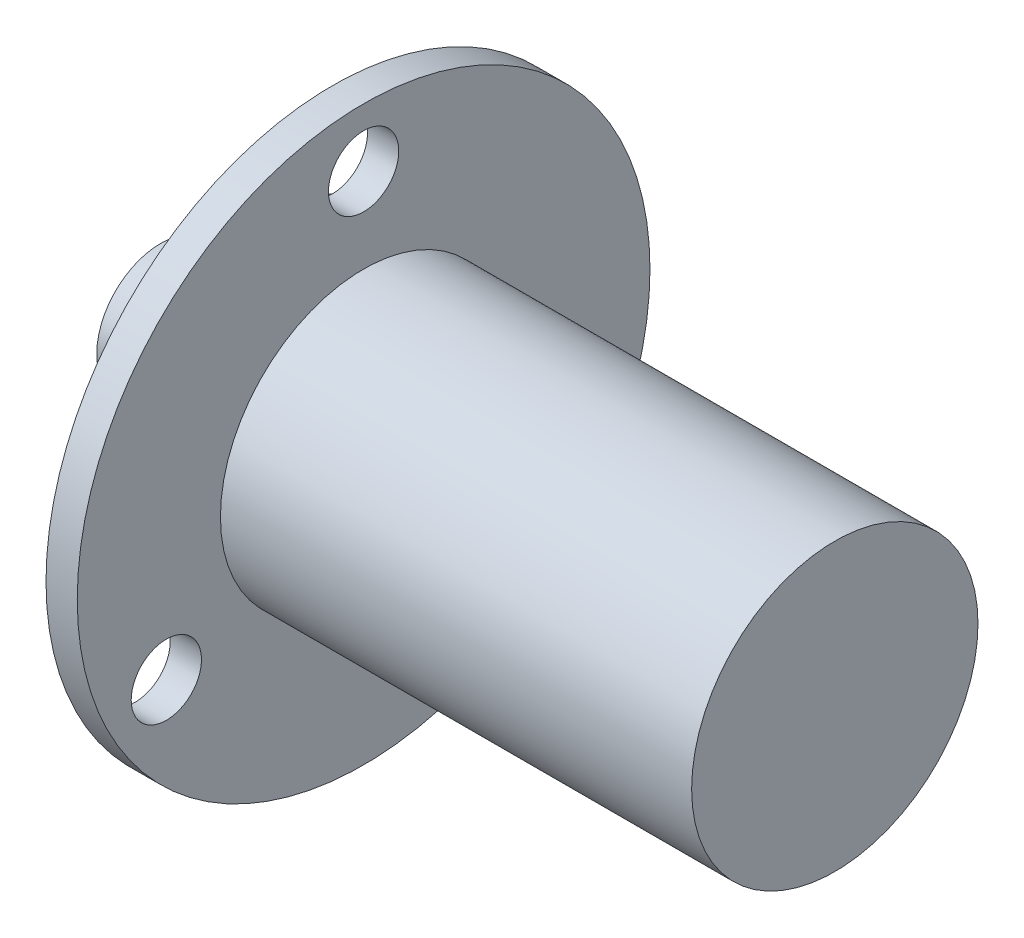
ISO-10303-21;
HEADER;
FILE_DESCRIPTION(('STEP AP214'),'2;1');
FILE_NAME('part.step','',(''),(''),'','','');
FILE_SCHEMA(('AUTOMOTIVE_DESIGN { 1 0 10303 214 1 1 1 1 }'));
ENDSEC;
DATA;
#1=APPLICATION_CONTEXT('core data for automotive mechanical design processes');
#2=APPLICATION_PROTOCOL_DEFINITION('international standard','automotive_design',2000,#1);
#3=PRODUCT_CONTEXT('',#1,'mechanical');
#4=PRODUCT('Part','Part','',(#3));
#5=PRODUCT_RELATED_PRODUCT_CATEGORY('part','',(#4));
#6=PRODUCT_DEFINITION_FORMATION('','',#4);
#7=PRODUCT_DEFINITION_CONTEXT('part definition',#1,'design');
#8=PRODUCT_DEFINITION('design','',#6,#7);
#9=PRODUCT_DEFINITION_SHAPE('','',#8);
#10=(LENGTH_UNIT() NAMED_UNIT(*) SI_UNIT(.MILLI.,.METRE.));
#11=(NAMED_UNIT(*) PLANE_ANGLE_UNIT() SI_UNIT($,.RADIAN.));
#12=(NAMED_UNIT(*) SI_UNIT($,.STERADIAN.) SOLID_ANGLE_UNIT());
#13=UNCERTAINTY_MEASURE_WITH_UNIT(LENGTH_MEASURE(1.E-05),#10,'distance_accuracy_value','');
#14=(GEOMETRIC_REPRESENTATION_CONTEXT(3) GLOBAL_UNCERTAINTY_ASSIGNED_CONTEXT((#13)) GLOBAL_UNIT_ASSIGNED_CONTEXT((#10,
#11,#12)) REPRESENTATION_CONTEXT('',''));
#15=CARTESIAN_POINT('',(0.,0.,0.));
#16=DIRECTION('',(0.,0.,1.));
#17=DIRECTION('',(1.,0.,0.));
#18=AXIS2_PLACEMENT_3D('',#15,#16,#17);
#19=CARTESIAN_POINT('',(0.,0.,0.));
#20=DIRECTION('',(1.,0.,0.));
#21=DIRECTION('',(0.,0.,-1.));
#22=AXIS2_PLACEMENT_3D('',#19,#20,#21);
#23=PLANE('',#22);
#24=CARTESIAN_POINT('',(0.,0.,0.));
#25=DIRECTION('',(-1.,0.,0.));
#26=DIRECTION('',(0.,0.,1.));
#27=AXIS2_PLACEMENT_3D('',#24,#25,#26);
#28=CIRCLE('',#27,4.9);
#29=CARTESIAN_POINT('',(0.,0.,4.9));
#30=VERTEX_POINT('',#29);
#31=EDGE_CURVE('E10',#30,#30,#28,.T.);
#32=ORIENTED_EDGE('',*,*,#31,.T.);
#33=EDGE_LOOP('',(#32));
#34=FACE_BOUND('',#33,.T.);
#35=ADVANCED_FACE('F39',(#34),#23,.F.);
#36=CARTESIAN_POINT('',(0.,0.,0.));
#37=DIRECTION('',(-1.,0.,0.));
#38=DIRECTION('',(0.,0.,1.));
#39=AXIS2_PLACEMENT_3D('',#36,#37,#38);
#40=CYLINDRICAL_SURFACE('',#39,4.9);
#41=ORIENTED_EDGE('',*,*,#31,.F.);
#42=EDGE_LOOP('',(#41));
#43=FACE_BOUND('',#42,.T.);
#44=CARTESIAN_POINT('',(8.2,0.,0.));
#45=DIRECTION('',(-1.,0.,0.));
#46=DIRECTION('',(0.,0.,1.));
#47=AXIS2_PLACEMENT_3D('',#44,#45,#46);
#48=CIRCLE('',#47,4.9);
#49=CARTESIAN_POINT('',(8.2,0.,4.9));
#50=VERTEX_POINT('',#49);
#51=EDGE_CURVE('E46',#50,#50,#48,.T.);
#52=ORIENTED_EDGE('',*,*,#51,.T.);
#53=EDGE_LOOP('',(#52));
#54=FACE_BOUND('',#53,.T.);
#55=ADVANCED_FACE('F136',(#43,#54),#40,.T.);
#56=CARTESIAN_POINT('',(8.2,4.9,0.));
#57=DIRECTION('',(1.,0.,0.));
#58=DIRECTION('',(0.,0.,-1.));
#59=AXIS2_PLACEMENT_3D('',#56,#57,#58);
#60=PLANE('',#59);
#61=ORIENTED_EDGE('',*,*,#51,.F.);
#62=EDGE_LOOP('',(#61));
#63=FACE_BOUND('',#62,.T.);
#64=CARTESIAN_POINT('',(8.2,0.,0.));
#65=DIRECTION('',(-1.,0.,0.));
#66=DIRECTION('',(0.,0.,1.));
#67=AXIS2_PLACEMENT_3D('',#64,#65,#66);
#68=CIRCLE('',#67,11.);
#69=CARTESIAN_POINT('',(8.2,0.,11.));
#70=VERTEX_POINT('',#69);
#71=EDGE_CURVE('E51',#70,#70,#68,.T.);
#72=ORIENTED_EDGE('',*,*,#71,.T.);
#73=EDGE_LOOP('',(#72));
#74=FACE_BOUND('',#73,.T.);
#75=ADVANCED_FACE('F91',(#63,#74),#60,.F.);
#76=CARTESIAN_POINT('',(0.,0.,0.));
#77=DIRECTION('',(-1.,0.,0.));
#78=DIRECTION('',(0.,0.,1.));
#79=AXIS2_PLACEMENT_3D('',#76,#77,#78);
#80=CYLINDRICAL_SURFACE('',#79,11.);
#81=ORIENTED_EDGE('',*,*,#71,.F.);
#82=EDGE_LOOP('',(#81));
#83=FACE_BOUND('',#82,.T.);
#84=CARTESIAN_POINT('',(13.2,0.,0.));
#85=DIRECTION('',(-1.,0.,0.));
#86=DIRECTION('',(0.,0.,1.));
#87=AXIS2_PLACEMENT_3D('',#84,#85,#86);
#88=CIRCLE('',#87,11.);
#89=CARTESIAN_POINT('',(13.2,0.,11.));
#90=VERTEX_POINT('',#89);
#91=EDGE_CURVE('E86',#90,#90,#88,.T.);
#92=ORIENTED_EDGE('',*,*,#91,.T.);
#93=EDGE_LOOP('',(#92));
#94=FACE_BOUND('',#93,.T.);
#95=ADVANCED_FACE('F93',(#83,#94),#80,.T.);
#96=CARTESIAN_POINT('',(13.2,11.,0.));
#97=DIRECTION('',(1.,0.,0.));
#98=DIRECTION('',(0.,0.,-1.));
#99=AXIS2_PLACEMENT_3D('',#96,#97,#98);
#100=PLANE('',#99);
#101=CARTESIAN_POINT('',(13.2,-8.75000000000007,-15.1554445662276));
#102=DIRECTION('',(-1.,0.,0.));
#103=DIRECTION('',(0.,0.866025403784436,-0.500000000000004));
#104=AXIS2_PLACEMENT_3D('',#101,#102,#103);
#105=CIRCLE('',#104,2.7);
#106=CARTESIAN_POINT('',(13.2,-6.41173140978209,-16.5054445662277));
#107=VERTEX_POINT('',#106);
#108=EDGE_CURVE('E61',#107,#107,#105,.T.);
#109=ORIENTED_EDGE('',*,*,#108,.F.);
#110=EDGE_LOOP('',(#109));
#111=FACE_BOUND('',#110,.T.);
#112=CARTESIAN_POINT('',(13.2,-8.74999999999986,15.1554445662278));
#113=DIRECTION('',(-1.,0.,0.));
#114=DIRECTION('',(0.,-0.866025403784443,-0.499999999999992));
#115=AXIS2_PLACEMENT_3D('',#112,#113,#114);
#116=CIRCLE('',#115,2.7);
#117=CARTESIAN_POINT('',(13.2,-11.0882685902179,13.8054445662278));
#118=VERTEX_POINT('',#117);
#119=EDGE_CURVE('E66',#118,#118,#116,.T.);
#120=ORIENTED_EDGE('',*,*,#119,.F.);
#121=EDGE_LOOP('',(#120));
#122=FACE_BOUND('',#121,.T.);
#123=CARTESIAN_POINT('',(13.2,17.5,0.));
#124=DIRECTION('',(-1.,0.,0.));
#125=DIRECTION('',(0.,0.,1.));
#126=AXIS2_PLACEMENT_3D('',#123,#124,#125);
#127=CIRCLE('',#126,2.7);
#128=CARTESIAN_POINT('',(13.2,17.5,2.7));
#129=VERTEX_POINT('',#128);
#130=EDGE_CURVE('E58',#129,#129,#127,.T.);
#131=ORIENTED_EDGE('',*,*,#130,.F.);
#132=EDGE_LOOP('',(#131));
#133=FACE_BOUND('',#132,.T.);
#134=ORIENTED_EDGE('',*,*,#91,.F.);
#135=EDGE_LOOP('',(#134));
#136=FACE_BOUND('',#135,.T.);
#137=CARTESIAN_POINT('',(13.2,0.,0.));
#138=DIRECTION('',(-1.,0.,0.));
#139=DIRECTION('',(0.,0.,1.));
#140=AXIS2_PLACEMENT_3D('',#137,#138,#139);
#141=CIRCLE('',#140,22.);
#142=CARTESIAN_POINT('',(13.2,0.,22.));
#143=VERTEX_POINT('',#142);
#144=EDGE_CURVE('E83',#143,#143,#141,.T.);
#145=ORIENTED_EDGE('',*,*,#144,.T.);
#146=EDGE_LOOP('',(#145));
#147=FACE_BOUND('',#146,.T.);
#148=ADVANCED_FACE('F96',(#111,#122,#133,#136,#147),#100,.F.);
#149=CARTESIAN_POINT('',(0.,0.,0.));
#150=DIRECTION('',(-1.,0.,0.));
#151=DIRECTION('',(0.,0.,1.));
#152=AXIS2_PLACEMENT_3D('',#149,#150,#151);
#153=CYLINDRICAL_SURFACE('',#152,22.);
#154=ORIENTED_EDGE('',*,*,#144,.F.);
#155=EDGE_LOOP('',(#154));
#156=FACE_BOUND('',#155,.T.);
#157=CARTESIAN_POINT('',(15.6,0.,0.));
#158=DIRECTION('',(-1.,0.,0.));
#159=DIRECTION('',(0.,0.,1.));
#160=AXIS2_PLACEMENT_3D('',#157,#158,#159);
#161=CIRCLE('',#160,22.);
#162=CARTESIAN_POINT('',(15.6,0.,22.));
#163=VERTEX_POINT('',#162);
#164=EDGE_CURVE('E80',#163,#163,#161,.T.);
#165=ORIENTED_EDGE('',*,*,#164,.T.);
#166=EDGE_LOOP('',(#165));
#167=FACE_BOUND('',#166,.T.);
#168=ADVANCED_FACE('F102',(#156,#167),#153,.T.);
#169=CARTESIAN_POINT('',(15.6,22.,0.));
#170=DIRECTION('',(-1.,0.,0.));
#171=DIRECTION('',(0.,0.,1.));
#172=AXIS2_PLACEMENT_3D('',#169,#170,#171);
#173=PLANE('',#172);
#174=CARTESIAN_POINT('',(15.6,-8.75000000000007,-15.1554445662276));
#175=DIRECTION('',(-1.,0.,0.));
#176=DIRECTION('',(0.,0.,1.));
#177=AXIS2_PLACEMENT_3D('',#174,#175,#176);
#178=CIRCLE('',#177,2.7);
#179=CARTESIAN_POINT('',(15.6,-8.75000000000007,-12.4554445662276));
#180=VERTEX_POINT('',#179);
#181=EDGE_CURVE('E42',#180,#180,#178,.T.);
#182=ORIENTED_EDGE('',*,*,#181,.T.);
#183=EDGE_LOOP('',(#182));
#184=FACE_BOUND('',#183,.T.);
#185=CARTESIAN_POINT('',(15.6,-8.74999999999986,15.1554445662278));
#186=DIRECTION('',(-1.,0.,0.));
#187=DIRECTION('',(0.,0.,1.));
#188=AXIS2_PLACEMENT_3D('',#185,#186,#187);
#189=CIRCLE('',#188,2.7);
#190=CARTESIAN_POINT('',(15.6,-8.74999999999986,17.8554445662278));
#191=VERTEX_POINT('',#190);
#192=EDGE_CURVE('E59',#191,#191,#189,.T.);
#193=ORIENTED_EDGE('',*,*,#192,.T.);
#194=EDGE_LOOP('',(#193));
#195=FACE_BOUND('',#194,.T.);
#196=CARTESIAN_POINT('',(15.6,17.5,0.));
#197=DIRECTION('',(-1.,0.,0.));
#198=DIRECTION('',(0.,0.,1.));
#199=AXIS2_PLACEMENT_3D('',#196,#197,#198);
#200=CIRCLE('',#199,2.7);
#201=CARTESIAN_POINT('',(15.6,17.5,2.7));
#202=VERTEX_POINT('',#201);
#203=EDGE_CURVE('E55',#202,#202,#200,.T.);
#204=ORIENTED_EDGE('',*,*,#203,.T.);
#205=EDGE_LOOP('',(#204));
#206=FACE_BOUND('',#205,.T.);
#207=ORIENTED_EDGE('',*,*,#164,.F.);
#208=EDGE_LOOP('',(#207));
#209=FACE_BOUND('',#208,.T.);
#210=CARTESIAN_POINT('',(15.6,0.,0.));
#211=DIRECTION('',(-1.,0.,0.));
#212=DIRECTION('',(0.,0.,1.));
#213=AXIS2_PLACEMENT_3D('',#210,#211,#212);
#214=CIRCLE('',#213,11.);
#215=CARTESIAN_POINT('',(15.6,0.,11.));
#216=VERTEX_POINT('',#215);
#217=EDGE_CURVE('E77',#216,#216,#214,.T.);
#218=ORIENTED_EDGE('',*,*,#217,.T.);
#219=EDGE_LOOP('',(#218));
#220=FACE_BOUND('',#219,.T.);
#221=ADVANCED_FACE('F109',(#184,#195,#206,#209,#220),#173,.F.);
#222=CARTESIAN_POINT('',(0.,0.,0.));
#223=DIRECTION('',(-1.,0.,0.));
#224=DIRECTION('',(0.,0.,1.));
#225=AXIS2_PLACEMENT_3D('',#222,#223,#224);
#226=CYLINDRICAL_SURFACE('',#225,11.);
#227=ORIENTED_EDGE('',*,*,#217,.F.);
#228=EDGE_LOOP('',(#227));
#229=FACE_BOUND('',#228,.T.);
#230=CARTESIAN_POINT('',(51.8,0.,0.));
#231=DIRECTION('',(-1.,0.,0.));
#232=DIRECTION('',(0.,0.,1.));
#233=AXIS2_PLACEMENT_3D('',#230,#231,#232);
#234=CIRCLE('',#233,11.);
#235=CARTESIAN_POINT('',(51.8,0.,11.));
#236=VERTEX_POINT('',#235);
#237=EDGE_CURVE('E57',#236,#236,#234,.T.);
#238=ORIENTED_EDGE('',*,*,#237,.T.);
#239=EDGE_LOOP('',(#238));
#240=FACE_BOUND('',#239,.T.);
#241=ADVANCED_FACE('F115',(#229,#240),#226,.T.);
#242=CARTESIAN_POINT('',(51.8,11.,0.));
#243=DIRECTION('',(-1.,0.,0.));
#244=DIRECTION('',(0.,0.,1.));
#245=AXIS2_PLACEMENT_3D('',#242,#243,#244);
#246=PLANE('',#245);
#247=ORIENTED_EDGE('',*,*,#237,.F.);
#248=EDGE_LOOP('',(#247));
#249=FACE_BOUND('',#248,.T.);
#250=ADVANCED_FACE('F122',(#249),#246,.F.);
#251=CARTESIAN_POINT('',(51.8,17.5,0.));
#252=DIRECTION('',(-1.,0.,0.));
#253=DIRECTION('',(0.,0.,1.));
#254=AXIS2_PLACEMENT_3D('',#251,#252,#253);
#255=CYLINDRICAL_SURFACE('',#254,2.7);
#256=ORIENTED_EDGE('',*,*,#130,.T.);
#257=EDGE_LOOP('',(#256));
#258=FACE_BOUND('',#257,.T.);
#259=ORIENTED_EDGE('',*,*,#203,.F.);
#260=EDGE_LOOP('',(#259));
#261=FACE_BOUND('',#260,.T.);
#262=ADVANCED_FACE('F127',(#258,#261),#255,.F.);
#263=CARTESIAN_POINT('',(51.8,-8.74999999999986,15.1554445662278));
#264=DIRECTION('',(-1.,0.,0.));
#265=DIRECTION('',(0.,0.,1.));
#266=AXIS2_PLACEMENT_3D('',#263,#264,#265);
#267=CYLINDRICAL_SURFACE('',#266,2.7);
#268=ORIENTED_EDGE('',*,*,#119,.T.);
#269=EDGE_LOOP('',(#268));
#270=FACE_BOUND('',#269,.T.);
#271=ORIENTED_EDGE('',*,*,#192,.F.);
#272=EDGE_LOOP('',(#271));
#273=FACE_BOUND('',#272,.T.);
#274=ADVANCED_FACE('F132',(#270,#273),#267,.F.);
#275=CARTESIAN_POINT('',(51.8,-8.75000000000007,-15.1554445662276));
#276=DIRECTION('',(-1.,0.,0.));
#277=DIRECTION('',(0.,0.,1.));
#278=AXIS2_PLACEMENT_3D('',#275,#276,#277);
#279=CYLINDRICAL_SURFACE('',#278,2.7);
#280=ORIENTED_EDGE('',*,*,#108,.T.);
#281=EDGE_LOOP('',(#280));
#282=FACE_BOUND('',#281,.T.);
#283=ORIENTED_EDGE('',*,*,#181,.F.);
#284=EDGE_LOOP('',(#283));
#285=FACE_BOUND('',#284,.T.);
#286=ADVANCED_FACE('F190',(#282,#285),#279,.F.);
#287=CLOSED_SHELL('',(#35,#55,#75,#95,#148,#168,#221,#241,#250,#262,#274,#286));
#288=MANIFOLD_SOLID_BREP('B2',#287);
#289=ADVANCED_BREP_SHAPE_REPRESENTATION('',(#18,#288),#14);
#290=SHAPE_DEFINITION_REPRESENTATION(#9,#289);
ENDSEC;
END-ISO-10303-21;
